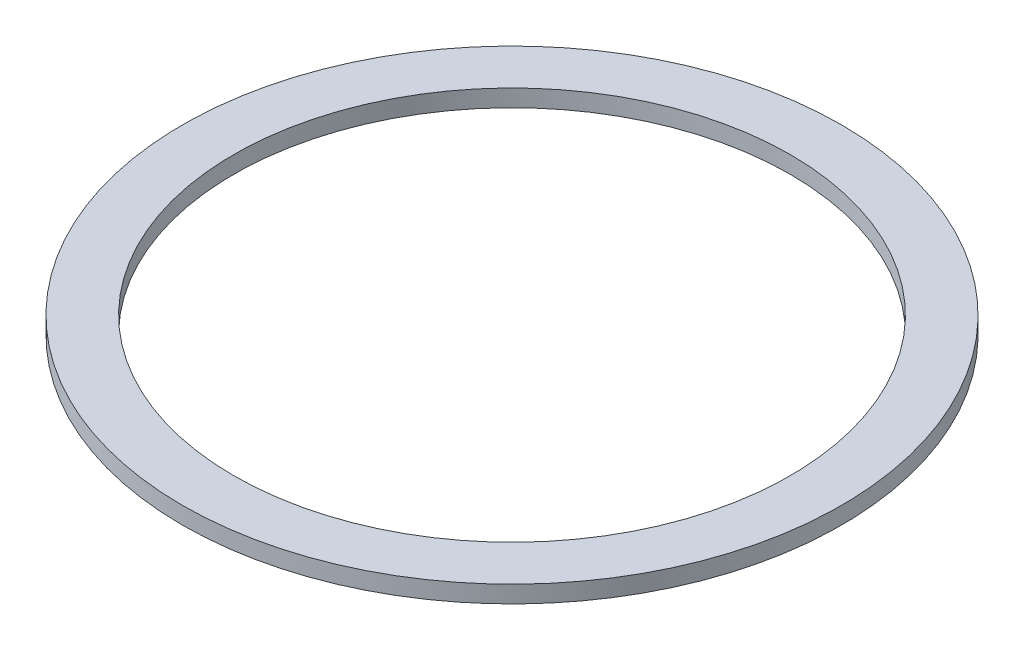
ISO-10303-21;
HEADER;
FILE_DESCRIPTION(('STEP AP214'),'2;1');
FILE_NAME('part.step','',(''),(''),'','','');
FILE_SCHEMA(('AUTOMOTIVE_DESIGN { 1 0 10303 214 1 1 1 1 }'));
ENDSEC;
DATA;
#1=APPLICATION_CONTEXT('core data for automotive mechanical design processes');
#2=APPLICATION_PROTOCOL_DEFINITION('international standard','automotive_design',2000,#1);
#3=PRODUCT_CONTEXT('',#1,'mechanical');
#4=PRODUCT('Part','Part','',(#3));
#5=PRODUCT_RELATED_PRODUCT_CATEGORY('part','',(#4));
#6=PRODUCT_DEFINITION_FORMATION('','',#4);
#7=PRODUCT_DEFINITION_CONTEXT('part definition',#1,'design');
#8=PRODUCT_DEFINITION('design','',#6,#7);
#9=PRODUCT_DEFINITION_SHAPE('','',#8);
#10=(LENGTH_UNIT() NAMED_UNIT(*) SI_UNIT(.MILLI.,.METRE.));
#11=(NAMED_UNIT(*) PLANE_ANGLE_UNIT() SI_UNIT($,.RADIAN.));
#12=(NAMED_UNIT(*) SI_UNIT($,.STERADIAN.) SOLID_ANGLE_UNIT());
#13=UNCERTAINTY_MEASURE_WITH_UNIT(LENGTH_MEASURE(1.E-05),#10,'distance_accuracy_value','');
#14=(GEOMETRIC_REPRESENTATION_CONTEXT(3) GLOBAL_UNCERTAINTY_ASSIGNED_CONTEXT((#13)) GLOBAL_UNIT_ASSIGNED_CONTEXT((#10,
#11,#12)) REPRESENTATION_CONTEXT('',''));
#15=CARTESIAN_POINT('',(0.,0.,0.));
#16=DIRECTION('',(0.,0.,1.));
#17=DIRECTION('',(1.,0.,0.));
#18=AXIS2_PLACEMENT_3D('',#15,#16,#17);
#19=CARTESIAN_POINT('',(0.,5.,0.));
#20=DIRECTION('',(0.,1.,0.));
#21=DIRECTION('',(0.,0.,1.));
#22=AXIS2_PLACEMENT_3D('',#19,#20,#21);
#23=PLANE('',#22);
#24=CARTESIAN_POINT('',(0.,5.,0.));
#25=DIRECTION('',(0.,1.,0.));
#26=DIRECTION('',(0.,0.,1.));
#27=AXIS2_PLACEMENT_3D('',#24,#25,#26);
#28=CIRCLE('',#27,192.5);
#29=CARTESIAN_POINT('',(0.,5.,192.5));
#30=VERTEX_POINT('',#29);
#31=EDGE_CURVE('E10',#30,#30,#28,.T.);
#32=ORIENTED_EDGE('',*,*,#31,.T.);
#33=EDGE_LOOP('',(#32));
#34=FACE_BOUND('',#33,.T.);
#35=CARTESIAN_POINT('',(0.,5.,0.));
#36=DIRECTION('',(0.,1.,0.));
#37=DIRECTION('',(0.,0.,1.));
#38=AXIS2_PLACEMENT_3D('',#35,#36,#37);
#39=CIRCLE('',#38,162.5);
#40=CARTESIAN_POINT('',(0.,5.,162.5));
#41=VERTEX_POINT('',#40);
#42=EDGE_CURVE('E50',#41,#41,#39,.T.);
#43=ORIENTED_EDGE('',*,*,#42,.F.);
#44=EDGE_LOOP('',(#43));
#45=FACE_BOUND('',#44,.T.);
#46=ADVANCED_FACE('F37',(#34,#45),#23,.T.);
#47=CARTESIAN_POINT('',(0.,-5.,0.));
#48=DIRECTION('',(0.,1.,0.));
#49=DIRECTION('',(0.,0.,1.));
#50=AXIS2_PLACEMENT_3D('',#47,#48,#49);
#51=PLANE('',#50);
#52=CARTESIAN_POINT('',(0.,-5.,0.));
#53=DIRECTION('',(0.,1.,0.));
#54=DIRECTION('',(0.,0.,1.));
#55=AXIS2_PLACEMENT_3D('',#52,#53,#54);
#56=CIRCLE('',#55,192.5);
#57=CARTESIAN_POINT('',(0.,-5.,192.5));
#58=VERTEX_POINT('',#57);
#59=EDGE_CURVE('E41',#58,#58,#56,.T.);
#60=ORIENTED_EDGE('',*,*,#59,.F.);
#61=EDGE_LOOP('',(#60));
#62=FACE_BOUND('',#61,.T.);
#63=CARTESIAN_POINT('',(0.,-5.,0.));
#64=DIRECTION('',(0.,1.,0.));
#65=DIRECTION('',(0.,0.,1.));
#66=AXIS2_PLACEMENT_3D('',#63,#64,#65);
#67=CIRCLE('',#66,162.5);
#68=CARTESIAN_POINT('',(0.,-5.,162.5));
#69=VERTEX_POINT('',#68);
#70=EDGE_CURVE('E52',#69,#69,#67,.T.);
#71=ORIENTED_EDGE('',*,*,#70,.T.);
#72=EDGE_LOOP('',(#71));
#73=FACE_BOUND('',#72,.T.);
#74=ADVANCED_FACE('F64',(#62,#73),#51,.F.);
#75=CARTESIAN_POINT('',(0.,5.,0.));
#76=DIRECTION('',(0.,-1.,0.));
#77=DIRECTION('',(0.,0.,-1.));
#78=AXIS2_PLACEMENT_3D('',#75,#76,#77);
#79=CYLINDRICAL_SURFACE('',#78,192.5);
#80=ORIENTED_EDGE('',*,*,#31,.F.);
#81=EDGE_LOOP('',(#80));
#82=FACE_BOUND('',#81,.T.);
#83=ORIENTED_EDGE('',*,*,#59,.T.);
#84=EDGE_LOOP('',(#83));
#85=FACE_BOUND('',#84,.T.);
#86=ADVANCED_FACE('F39',(#82,#85),#79,.T.);
#87=CARTESIAN_POINT('',(0.,5.,0.));
#88=DIRECTION('',(0.,-1.,0.));
#89=DIRECTION('',(0.,0.,-1.));
#90=AXIS2_PLACEMENT_3D('',#87,#88,#89);
#91=CYLINDRICAL_SURFACE('',#90,162.5);
#92=ORIENTED_EDGE('',*,*,#42,.T.);
#93=EDGE_LOOP('',(#92));
#94=FACE_BOUND('',#93,.T.);
#95=ORIENTED_EDGE('',*,*,#70,.F.);
#96=EDGE_LOOP('',(#95));
#97=FACE_BOUND('',#96,.T.);
#98=ADVANCED_FACE('F60',(#94,#97),#91,.F.);
#99=CLOSED_SHELL('',(#46,#74,#86,#98));
#100=MANIFOLD_SOLID_BREP('B2',#99);
#101=ADVANCED_BREP_SHAPE_REPRESENTATION('',(#18,#100),#14);
#102=SHAPE_DEFINITION_REPRESENTATION(#9,#101);
ENDSEC;
END-ISO-10303-21;
